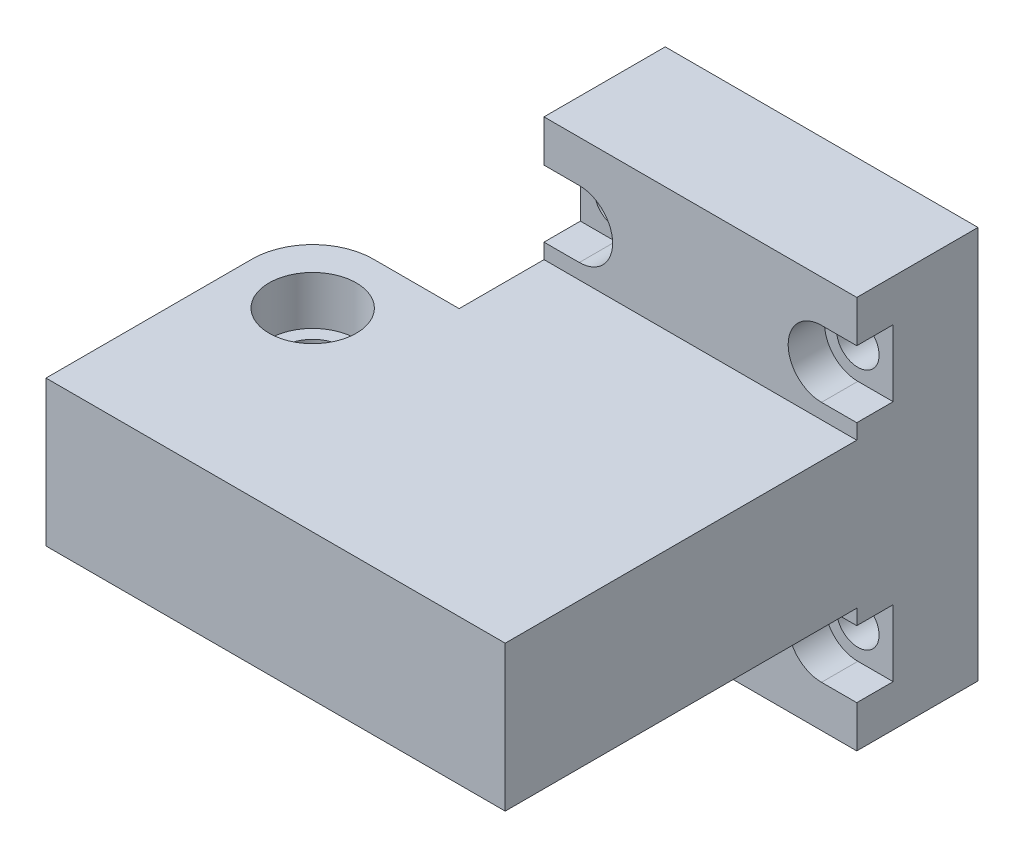
ISO-10303-21;
HEADER;
FILE_DESCRIPTION(('STEP AP214'),'2;1');
FILE_NAME('part.step','',(''),(''),'','','');
FILE_SCHEMA(('AUTOMOTIVE_DESIGN { 1 0 10303 214 1 1 1 1 }'));
ENDSEC;
DATA;
#1=APPLICATION_CONTEXT('core data for automotive mechanical design processes');
#2=APPLICATION_PROTOCOL_DEFINITION('international standard','automotive_design',2000,#1);
#3=PRODUCT_CONTEXT('',#1,'mechanical');
#4=PRODUCT('Part','Part','',(#3));
#5=PRODUCT_RELATED_PRODUCT_CATEGORY('part','',(#4));
#6=PRODUCT_DEFINITION_FORMATION('','',#4);
#7=PRODUCT_DEFINITION_CONTEXT('part definition',#1,'design');
#8=PRODUCT_DEFINITION('design','',#6,#7);
#9=PRODUCT_DEFINITION_SHAPE('','',#8);
#10=(LENGTH_UNIT() NAMED_UNIT(*) SI_UNIT(.MILLI.,.METRE.));
#11=(NAMED_UNIT(*) PLANE_ANGLE_UNIT() SI_UNIT($,.RADIAN.));
#12=(NAMED_UNIT(*) SI_UNIT($,.STERADIAN.) SOLID_ANGLE_UNIT());
#13=UNCERTAINTY_MEASURE_WITH_UNIT(LENGTH_MEASURE(1.E-05),#10,'distance_accuracy_value','');
#14=(GEOMETRIC_REPRESENTATION_CONTEXT(3) GLOBAL_UNCERTAINTY_ASSIGNED_CONTEXT((#13)) GLOBAL_UNIT_ASSIGNED_CONTEXT((#10,
#11,#12)) REPRESENTATION_CONTEXT('',''));
#15=CARTESIAN_POINT('',(0.,0.,0.));
#16=DIRECTION('',(0.,0.,1.));
#17=DIRECTION('',(1.,0.,0.));
#18=AXIS2_PLACEMENT_3D('',#15,#16,#17);
#19=CARTESIAN_POINT('',(12.070747766079,5.77857142857143,7.));
#20=DIRECTION('',(0.,0.,1.));
#21=DIRECTION('',(1.,0.,0.));
#22=AXIS2_PLACEMENT_3D('',#19,#20,#21);
#23=CYLINDRICAL_SURFACE('',#22,2.75);
#24=DIRECTION('',(0.,0.,1.));
#25=VECTOR('',#24,1.);
#26=CARTESIAN_POINT('',(12.070747766079,8.52857142857143,7.));
#27=LINE('',#26,#25);
#28=CARTESIAN_POINT('',(12.070747766079,8.52857142857143,7.));
#29=VERTEX_POINT('',#28);
#30=CARTESIAN_POINT('',(12.070747766079,8.52857142857143,10.));
#31=VERTEX_POINT('',#30);
#32=EDGE_CURVE('E403',#29,#31,#27,.T.);
#33=ORIENTED_EDGE('',*,*,#32,.T.);
#34=CARTESIAN_POINT('',(12.070747766079,5.77857142857143,10.));
#35=DIRECTION('',(0.,0.,1.));
#36=DIRECTION('',(1.,0.,0.));
#37=AXIS2_PLACEMENT_3D('',#34,#35,#36);
#38=CIRCLE('',#37,2.75);
#39=CARTESIAN_POINT('',(12.070747766079,3.02857142857143,10.));
#40=VERTEX_POINT('',#39);
#41=EDGE_CURVE('E232',#31,#40,#38,.T.);
#42=ORIENTED_EDGE('',*,*,#41,.T.);
#43=DIRECTION('',(0.,0.,1.));
#44=VECTOR('',#43,1.);
#45=CARTESIAN_POINT('',(12.070747766079,3.02857142857143,7.));
#46=LINE('',#45,#44);
#47=CARTESIAN_POINT('',(12.070747766079,3.02857142857143,7.));
#48=VERTEX_POINT('',#47);
#49=EDGE_CURVE('E218',#48,#40,#46,.T.);
#50=ORIENTED_EDGE('',*,*,#49,.F.);
#51=CARTESIAN_POINT('',(12.070747766079,5.77857142857143,7.));
#52=DIRECTION('',(0.,0.,1.));
#53=DIRECTION('',(1.,0.,0.));
#54=AXIS2_PLACEMENT_3D('',#51,#52,#53);
#55=CIRCLE('',#54,2.75);
#56=EDGE_CURVE('E230',#29,#48,#55,.T.);
#57=ORIENTED_EDGE('',*,*,#56,.F.);
#58=EDGE_LOOP('',(#33,#42,#50,#57));
#59=FACE_BOUND('',#58,.T.);
#60=ADVANCED_FACE('F35',(#59),#23,.F.);
#61=CARTESIAN_POINT('',(-7.90925223392101,-14.2214285714286,7.));
#62=DIRECTION('',(0.,0.,1.));
#63=DIRECTION('',(1.,0.,0.));
#64=AXIS2_PLACEMENT_3D('',#61,#62,#63);
#65=CYLINDRICAL_SURFACE('',#64,2.75);
#66=DIRECTION('',(0.,0.,1.));
#67=VECTOR('',#66,1.);
#68=CARTESIAN_POINT('',(-7.90925223392101,-16.9714285714286,7.));
#69=LINE('',#68,#67);
#70=CARTESIAN_POINT('',(-7.90925223392101,-16.9714285714286,7.));
#71=VERTEX_POINT('',#70);
#72=CARTESIAN_POINT('',(-7.90925223392101,-16.9714285714286,10.));
#73=VERTEX_POINT('',#72);
#74=EDGE_CURVE('E461',#71,#73,#69,.T.);
#75=ORIENTED_EDGE('',*,*,#74,.T.);
#76=CARTESIAN_POINT('',(-7.90925223392101,-14.2214285714286,10.));
#77=DIRECTION('',(0.,0.,1.));
#78=DIRECTION('',(1.,0.,0.));
#79=AXIS2_PLACEMENT_3D('',#76,#77,#78);
#80=CIRCLE('',#79,2.75);
#81=CARTESIAN_POINT('',(-7.90925223392101,-11.4714285714286,10.));
#82=VERTEX_POINT('',#81);
#83=EDGE_CURVE('E376',#73,#82,#80,.T.);
#84=ORIENTED_EDGE('',*,*,#83,.T.);
#85=DIRECTION('',(0.,0.,1.));
#86=VECTOR('',#85,1.);
#87=CARTESIAN_POINT('',(-7.90925223392101,-11.4714285714286,7.));
#88=LINE('',#87,#86);
#89=CARTESIAN_POINT('',(-7.90925223392101,-11.4714285714286,7.));
#90=VERTEX_POINT('',#89);
#91=EDGE_CURVE('E490',#90,#82,#88,.T.);
#92=ORIENTED_EDGE('',*,*,#91,.F.);
#93=CARTESIAN_POINT('',(-7.90925223392101,-14.2214285714286,7.));
#94=DIRECTION('',(0.,0.,1.));
#95=DIRECTION('',(1.,0.,0.));
#96=AXIS2_PLACEMENT_3D('',#93,#94,#95);
#97=CIRCLE('',#96,2.75);
#98=EDGE_CURVE('E374',#71,#90,#97,.T.);
#99=ORIENTED_EDGE('',*,*,#98,.F.);
#100=EDGE_LOOP('',(#75,#84,#92,#99));
#101=FACE_BOUND('',#100,.T.);
#102=ADVANCED_FACE('F539',(#101),#65,.F.);
#103=CARTESIAN_POINT('',(-7.90925223392101,5.77857142857143,7.));
#104=DIRECTION('',(0.,0.,1.));
#105=DIRECTION('',(1.,0.,0.));
#106=AXIS2_PLACEMENT_3D('',#103,#104,#105);
#107=CYLINDRICAL_SURFACE('',#106,2.75);
#108=DIRECTION('',(0.,0.,1.));
#109=VECTOR('',#108,1.);
#110=CARTESIAN_POINT('',(-7.90925223392101,3.02857142857143,7.));
#111=LINE('',#110,#109);
#112=CARTESIAN_POINT('',(-7.90925223392101,3.02857142857143,7.));
#113=VERTEX_POINT('',#112);
#114=CARTESIAN_POINT('',(-7.90925223392101,3.02857142857143,10.));
#115=VERTEX_POINT('',#114);
#116=EDGE_CURVE('E470',#113,#115,#111,.T.);
#117=ORIENTED_EDGE('',*,*,#116,.T.);
#118=CARTESIAN_POINT('',(-7.90925223392101,5.77857142857143,10.));
#119=DIRECTION('',(0.,0.,1.));
#120=DIRECTION('',(1.,0.,0.));
#121=AXIS2_PLACEMENT_3D('',#118,#119,#120);
#122=CIRCLE('',#121,2.75);
#123=CARTESIAN_POINT('',(-7.90925223392101,8.52857142857143,10.));
#124=VERTEX_POINT('',#123);
#125=EDGE_CURVE('E371',#115,#124,#122,.T.);
#126=ORIENTED_EDGE('',*,*,#125,.T.);
#127=DIRECTION('',(0.,0.,1.));
#128=VECTOR('',#127,1.);
#129=CARTESIAN_POINT('',(-7.90925223392101,8.52857142857143,7.));
#130=LINE('',#129,#128);
#131=CARTESIAN_POINT('',(-7.90925223392101,8.52857142857143,7.));
#132=VERTEX_POINT('',#131);
#133=EDGE_CURVE('E468',#132,#124,#130,.T.);
#134=ORIENTED_EDGE('',*,*,#133,.F.);
#135=CARTESIAN_POINT('',(-7.90925223392101,5.77857142857143,7.));
#136=DIRECTION('',(0.,0.,1.));
#137=DIRECTION('',(1.,0.,0.));
#138=AXIS2_PLACEMENT_3D('',#135,#136,#137);
#139=CIRCLE('',#138,2.75);
#140=EDGE_CURVE('E240',#113,#132,#139,.T.);
#141=ORIENTED_EDGE('',*,*,#140,.F.);
#142=EDGE_LOOP('',(#117,#126,#134,#141));
#143=FACE_BOUND('',#142,.T.);
#144=ADVANCED_FACE('F466',(#143),#107,.F.);
#145=CARTESIAN_POINT('',(12.070747766079,-14.2214285714286,7.));
#146=DIRECTION('',(0.,0.,1.));
#147=DIRECTION('',(1.,0.,0.));
#148=AXIS2_PLACEMENT_3D('',#145,#146,#147);
#149=CYLINDRICAL_SURFACE('',#148,2.75);
#150=DIRECTION('',(0.,0.,1.));
#151=VECTOR('',#150,1.);
#152=CARTESIAN_POINT('',(12.070747766079,-11.4714285714286,7.));
#153=LINE('',#152,#151);
#154=CARTESIAN_POINT('',(12.070747766079,-11.4714285714286,7.));
#155=VERTEX_POINT('',#154);
#156=CARTESIAN_POINT('',(12.070747766079,-11.4714285714286,10.));
#157=VERTEX_POINT('',#156);
#158=EDGE_CURVE('E391',#155,#157,#153,.T.);
#159=ORIENTED_EDGE('',*,*,#158,.T.);
#160=CARTESIAN_POINT('',(12.070747766079,-14.2214285714286,10.));
#161=DIRECTION('',(0.,0.,1.));
#162=DIRECTION('',(1.,0.,0.));
#163=AXIS2_PLACEMENT_3D('',#160,#161,#162);
#164=CIRCLE('',#163,2.75);
#165=CARTESIAN_POINT('',(12.070747766079,-16.9714285714286,10.));
#166=VERTEX_POINT('',#165);
#167=EDGE_CURVE('E243',#157,#166,#164,.T.);
#168=ORIENTED_EDGE('',*,*,#167,.T.);
#169=DIRECTION('',(0.,0.,1.));
#170=VECTOR('',#169,1.);
#171=CARTESIAN_POINT('',(12.070747766079,-16.9714285714286,7.));
#172=LINE('',#171,#170);
#173=CARTESIAN_POINT('',(12.070747766079,-16.9714285714286,7.));
#174=VERTEX_POINT('',#173);
#175=EDGE_CURVE('E389',#174,#166,#172,.T.);
#176=ORIENTED_EDGE('',*,*,#175,.F.);
#177=CARTESIAN_POINT('',(12.070747766079,-14.2214285714286,7.));
#178=DIRECTION('',(0.,0.,1.));
#179=DIRECTION('',(1.,0.,0.));
#180=AXIS2_PLACEMENT_3D('',#177,#178,#179);
#181=CIRCLE('',#180,2.75);
#182=EDGE_CURVE('E378',#155,#174,#181,.T.);
#183=ORIENTED_EDGE('',*,*,#182,.F.);
#184=EDGE_LOOP('',(#159,#168,#176,#183));
#185=FACE_BOUND('',#184,.T.);
#186=ADVANCED_FACE('F388',(#185),#149,.F.);
#187=CARTESIAN_POINT('',(-16.899252233921,1.77857142857142,23.));
#188=DIRECTION('',(0.,-1.,0.));
#189=DIRECTION('',(1.,0.,0.));
#190=AXIS2_PLACEMENT_3D('',#187,#188,#189);
#191=CYLINDRICAL_SURFACE('',#190,2.5);
#192=CARTESIAN_POINT('',(-16.899252233921,-10.2214285714286,23.));
#193=DIRECTION('',(0.,-1.,0.));
#194=DIRECTION('',(1.,0.,0.));
#195=AXIS2_PLACEMENT_3D('',#192,#193,#194);
#196=CIRCLE('',#195,2.5);
#197=CARTESIAN_POINT('',(-14.399252233921,-10.2214285714286,23.));
#198=VERTEX_POINT('',#197);
#199=EDGE_CURVE('E344',#198,#198,#196,.T.);
#200=ORIENTED_EDGE('',*,*,#199,.T.);
#201=EDGE_LOOP('',(#200));
#202=FACE_BOUND('',#201,.T.);
#203=CARTESIAN_POINT('',(-16.899252233921,-2.22142857142858,23.));
#204=DIRECTION('',(0.,1.,0.));
#205=DIRECTION('',(0.,0.,1.));
#206=AXIS2_PLACEMENT_3D('',#203,#204,#205);
#207=CIRCLE('',#206,2.5);
#208=CARTESIAN_POINT('',(-16.899252233921,-2.22142857142858,25.5));
#209=VERTEX_POINT('',#208);
#210=EDGE_CURVE('E39',#209,#209,#207,.F.);
#211=ORIENTED_EDGE('',*,*,#210,.F.);
#212=EDGE_LOOP('',(#211));
#213=FACE_BOUND('',#212,.T.);
#214=ADVANCED_FACE('F568',(#202,#213),#191,.F.);
#215=CARTESIAN_POINT('',(-10.819252233921,11.9785714285714,10.));
#216=DIRECTION('',(1.,0.,0.));
#217=DIRECTION('',(0.,1.,0.));
#218=AXIS2_PLACEMENT_3D('',#215,#216,#217);
#219=PLANE('',#218);
#220=DIRECTION('',(0.,-1.,0.));
#221=VECTOR('',#220,1.);
#222=CARTESIAN_POINT('',(-10.819252233921,11.9785714285714,10.));
#223=LINE('',#222,#221);
#224=CARTESIAN_POINT('',(-10.819252233921,3.02857142857143,10.));
#225=VERTEX_POINT('',#224);
#226=CARTESIAN_POINT('',(-10.819252233921,1.77857142857142,10.));
#227=VERTEX_POINT('',#226);
#228=EDGE_CURVE('E270',#225,#227,#223,.T.);
#229=ORIENTED_EDGE('',*,*,#228,.F.);
#230=DIRECTION('',(0.,0.,1.));
#231=VECTOR('',#230,1.);
#232=CARTESIAN_POINT('',(-10.819252233921,3.02857142857143,7.));
#233=LINE('',#232,#231);
#234=CARTESIAN_POINT('',(-10.819252233921,3.02857142857143,7.));
#235=VERTEX_POINT('',#234);
#236=EDGE_CURVE('E474',#235,#225,#233,.T.);
#237=ORIENTED_EDGE('',*,*,#236,.F.);
#238=DIRECTION('',(0.,-1.,0.));
#239=VECTOR('',#238,1.);
#240=CARTESIAN_POINT('',(-10.819252233921,3.02857142857143,7.));
#241=LINE('',#240,#239);
#242=CARTESIAN_POINT('',(-10.819252233921,8.52857142857143,7.));
#243=VERTEX_POINT('',#242);
#244=EDGE_CURVE('E883',#243,#235,#241,.T.);
#245=ORIENTED_EDGE('',*,*,#244,.F.);
#246=DIRECTION('',(0.,0.,1.));
#247=VECTOR('',#246,1.);
#248=CARTESIAN_POINT('',(-10.819252233921,8.52857142857143,7.));
#249=LINE('',#248,#247);
#250=CARTESIAN_POINT('',(-10.819252233921,8.52857142857143,10.));
#251=VERTEX_POINT('',#250);
#252=EDGE_CURVE('E454',#243,#251,#249,.T.);
#253=ORIENTED_EDGE('',*,*,#252,.T.);
#254=CARTESIAN_POINT('',(-10.819252233921,11.9785714285714,10.));
#255=VERTEX_POINT('',#254);
#256=EDGE_CURVE('E266',#255,#251,#223,.T.);
#257=ORIENTED_EDGE('',*,*,#256,.F.);
#258=DIRECTION('',(0.,0.,-1.));
#259=VECTOR('',#258,1.);
#260=CARTESIAN_POINT('',(-10.819252233921,11.9785714285714,10.));
#261=LINE('',#260,#259);
#262=CARTESIAN_POINT('',(-10.819252233921,11.9785714285714,0.));
#263=VERTEX_POINT('',#262);
#264=EDGE_CURVE('E281',#255,#263,#261,.T.);
#265=ORIENTED_EDGE('',*,*,#264,.T.);
#266=DIRECTION('',(0.,-1.,0.));
#267=VECTOR('',#266,1.);
#268=CARTESIAN_POINT('',(-10.819252233921,11.9785714285714,0.));
#269=LINE('',#268,#267);
#270=CARTESIAN_POINT('',(-10.819252233921,-20.4214285714286,0.));
#271=VERTEX_POINT('',#270);
#272=EDGE_CURVE('E265',#263,#271,#269,.T.);
#273=ORIENTED_EDGE('',*,*,#272,.T.);
#274=DIRECTION('',(0.,0.,-1.));
#275=VECTOR('',#274,1.);
#276=CARTESIAN_POINT('',(-10.819252233921,-20.4214285714286,10.));
#277=LINE('',#276,#275);
#278=CARTESIAN_POINT('',(-10.819252233921,-20.4214285714286,10.));
#279=VERTEX_POINT('',#278);
#280=EDGE_CURVE('E299',#279,#271,#277,.T.);
#281=ORIENTED_EDGE('',*,*,#280,.F.);
#282=CARTESIAN_POINT('',(-10.819252233921,-16.9714285714286,10.));
#283=VERTEX_POINT('',#282);
#284=EDGE_CURVE('E290',#283,#279,#223,.T.);
#285=ORIENTED_EDGE('',*,*,#284,.F.);
#286=DIRECTION('',(0.,0.,1.));
#287=VECTOR('',#286,1.);
#288=CARTESIAN_POINT('',(-10.819252233921,-16.9714285714286,7.));
#289=LINE('',#288,#287);
#290=CARTESIAN_POINT('',(-10.819252233921,-16.9714285714286,7.));
#291=VERTEX_POINT('',#290);
#292=EDGE_CURVE('E496',#291,#283,#289,.T.);
#293=ORIENTED_EDGE('',*,*,#292,.F.);
#294=DIRECTION('',(0.,-1.,0.));
#295=VECTOR('',#294,1.);
#296=CARTESIAN_POINT('',(-10.819252233921,-11.4714285714286,7.));
#297=LINE('',#296,#295);
#298=CARTESIAN_POINT('',(-10.819252233921,-11.4714285714286,7.));
#299=VERTEX_POINT('',#298);
#300=EDGE_CURVE('E486',#299,#291,#297,.T.);
#301=ORIENTED_EDGE('',*,*,#300,.F.);
#302=DIRECTION('',(0.,0.,1.));
#303=VECTOR('',#302,1.);
#304=CARTESIAN_POINT('',(-10.819252233921,-11.4714285714286,7.));
#305=LINE('',#304,#303);
#306=CARTESIAN_POINT('',(-10.819252233921,-11.4714285714286,10.));
#307=VERTEX_POINT('',#306);
#308=EDGE_CURVE('E498',#299,#307,#305,.T.);
#309=ORIENTED_EDGE('',*,*,#308,.T.);
#310=CARTESIAN_POINT('',(-10.819252233921,-10.2214285714286,10.));
#311=VERTEX_POINT('',#310);
#312=EDGE_CURVE('E271',#311,#307,#223,.T.);
#313=ORIENTED_EDGE('',*,*,#312,.F.);
#314=DIRECTION('',(0.,0.,-1.));
#315=VECTOR('',#314,1.);
#316=CARTESIAN_POINT('',(-10.819252233921,-10.2214285714286,39.));
#317=LINE('',#316,#315);
#318=CARTESIAN_POINT('',(-10.819252233921,-10.2214285714286,17.));
#319=VERTEX_POINT('',#318);
#320=EDGE_CURVE('E263',#319,#311,#317,.T.);
#321=ORIENTED_EDGE('',*,*,#320,.F.);
#322=DIRECTION('',(0.,-1.,0.));
#323=VECTOR('',#322,1.);
#324=CARTESIAN_POINT('',(-10.819252233921,-10.2214285714286,17.));
#325=LINE('',#324,#323);
#326=CARTESIAN_POINT('',(-10.819252233921,1.77857142857142,17.));
#327=VERTEX_POINT('',#326);
#328=EDGE_CURVE('E343',#327,#319,#325,.T.);
#329=ORIENTED_EDGE('',*,*,#328,.F.);
#330=DIRECTION('',(0.,0.,-1.));
#331=VECTOR('',#330,1.);
#332=CARTESIAN_POINT('',(-10.819252233921,1.77857142857142,39.));
#333=LINE('',#332,#331);
#334=EDGE_CURVE('E251',#327,#227,#333,.T.);
#335=ORIENTED_EDGE('',*,*,#334,.T.);
#336=EDGE_LOOP('',(#229,#237,#245,#253,#257,#265,#273,#281,#285,#293,#301,#309,#313,#321,#329,#335));
#337=FACE_BOUND('',#336,.T.);
#338=ADVANCED_FACE('F452',(#337),#219,.F.);
#339=CARTESIAN_POINT('',(0.,0.,10.));
#340=DIRECTION('',(0.,0.,1.));
#341=DIRECTION('',(1.,0.,0.));
#342=AXIS2_PLACEMENT_3D('',#339,#340,#341);
#343=PLANE('',#342);
#344=DIRECTION('',(-1.,0.,0.));
#345=VECTOR('',#344,1.);
#346=CARTESIAN_POINT('',(12.070747766079,8.52857142857143,10.));
#347=LINE('',#346,#345);
#348=CARTESIAN_POINT('',(14.980747766079,8.52857142857143,10.));
#349=VERTEX_POINT('',#348);
#350=EDGE_CURVE('E224',#349,#31,#347,.T.);
#351=ORIENTED_EDGE('',*,*,#350,.F.);
#352=DIRECTION('',(0.,1.,0.));
#353=VECTOR('',#352,1.);
#354=CARTESIAN_POINT('',(14.980747766079,11.9785714285714,10.));
#355=LINE('',#354,#353);
#356=CARTESIAN_POINT('',(14.980747766079,11.9785714285714,10.));
#357=VERTEX_POINT('',#356);
#358=EDGE_CURVE('E273',#349,#357,#355,.T.);
#359=ORIENTED_EDGE('',*,*,#358,.T.);
#360=DIRECTION('',(-1.,0.,0.));
#361=VECTOR('',#360,1.);
#362=CARTESIAN_POINT('',(-10.819252233921,11.9785714285714,10.));
#363=LINE('',#362,#361);
#364=EDGE_CURVE('E277',#357,#255,#363,.T.);
#365=ORIENTED_EDGE('',*,*,#364,.T.);
#366=ORIENTED_EDGE('',*,*,#256,.T.);
#367=DIRECTION('',(-1.,0.,0.));
#368=VECTOR('',#367,1.);
#369=CARTESIAN_POINT('',(-7.90925223392101,8.52857142857143,10.));
#370=LINE('',#369,#368);
#371=EDGE_CURVE('E457',#124,#251,#370,.T.);
#372=ORIENTED_EDGE('',*,*,#371,.F.);
#373=ORIENTED_EDGE('',*,*,#125,.F.);
#374=DIRECTION('',(1.,0.,0.));
#375=VECTOR('',#374,1.);
#376=CARTESIAN_POINT('',(-7.90925223392101,3.02857142857143,10.));
#377=LINE('',#376,#375);
#378=EDGE_CURVE('E460',#225,#115,#377,.T.);
#379=ORIENTED_EDGE('',*,*,#378,.F.);
#380=ORIENTED_EDGE('',*,*,#228,.T.);
#381=DIRECTION('',(-1.,0.,0.));
#382=VECTOR('',#381,1.);
#383=CARTESIAN_POINT('',(-10.819252233921,1.77857142857142,10.));
#384=LINE('',#383,#382);
#385=CARTESIAN_POINT('',(14.980747766079,1.77857142857142,10.));
#386=VERTEX_POINT('',#385);
#387=EDGE_CURVE('E238',#386,#227,#384,.T.);
#388=ORIENTED_EDGE('',*,*,#387,.F.);
#389=CARTESIAN_POINT('',(14.980747766079,3.02857142857143,10.));
#390=VERTEX_POINT('',#389);
#391=EDGE_CURVE('E279',#386,#390,#355,.T.);
#392=ORIENTED_EDGE('',*,*,#391,.T.);
#393=DIRECTION('',(1.,0.,0.));
#394=VECTOR('',#393,1.);
#395=CARTESIAN_POINT('',(12.070747766079,3.02857142857143,10.));
#396=LINE('',#395,#394);
#397=EDGE_CURVE('E473',#40,#390,#396,.T.);
#398=ORIENTED_EDGE('',*,*,#397,.F.);
#399=ORIENTED_EDGE('',*,*,#41,.F.);
#400=EDGE_LOOP('',(#351,#359,#365,#366,#372,#373,#379,#380,#388,#392,#398,#399));
#401=FACE_BOUND('',#400,.T.);
#402=ADVANCED_FACE('F439',(#401),#343,.T.);
#403=CARTESIAN_POINT('',(-10.819252233921,-20.4214285714286,10.));
#404=DIRECTION('',(0.,1.,0.));
#405=DIRECTION('',(0.,0.,1.));
#406=AXIS2_PLACEMENT_3D('',#403,#404,#405);
#407=PLANE('',#406);
#408=DIRECTION('',(1.,0.,0.));
#409=VECTOR('',#408,1.);
#410=CARTESIAN_POINT('',(-10.819252233921,-20.4214285714286,0.));
#411=LINE('',#410,#409);
#412=CARTESIAN_POINT('',(14.980747766079,-20.4214285714286,0.));
#413=VERTEX_POINT('',#412);
#414=EDGE_CURVE('E284',#271,#413,#411,.T.);
#415=ORIENTED_EDGE('',*,*,#414,.T.);
#416=DIRECTION('',(0.,0.,-1.));
#417=VECTOR('',#416,1.);
#418=CARTESIAN_POINT('',(14.980747766079,-20.4214285714286,10.));
#419=LINE('',#418,#417);
#420=CARTESIAN_POINT('',(14.980747766079,-20.4214285714286,10.));
#421=VERTEX_POINT('',#420);
#422=EDGE_CURVE('E296',#421,#413,#419,.T.);
#423=ORIENTED_EDGE('',*,*,#422,.F.);
#424=DIRECTION('',(1.,0.,0.));
#425=VECTOR('',#424,1.);
#426=CARTESIAN_POINT('',(-10.819252233921,-20.4214285714286,10.));
#427=LINE('',#426,#425);
#428=EDGE_CURVE('E269',#279,#421,#427,.T.);
#429=ORIENTED_EDGE('',*,*,#428,.F.);
#430=ORIENTED_EDGE('',*,*,#280,.T.);
#431=EDGE_LOOP('',(#415,#423,#429,#430));
#432=FACE_BOUND('',#431,.T.);
#433=ADVANCED_FACE('F522',(#432),#407,.F.);
#434=CARTESIAN_POINT('',(14.980747766079,11.9785714285714,10.));
#435=DIRECTION('',(-1.,0.,0.));
#436=DIRECTION('',(0.,-1.,0.));
#437=AXIS2_PLACEMENT_3D('',#434,#435,#436);
#438=PLANE('',#437);
#439=ORIENTED_EDGE('',*,*,#358,.F.);
#440=DIRECTION('',(0.,0.,1.));
#441=VECTOR('',#440,1.);
#442=CARTESIAN_POINT('',(14.980747766079,8.52857142857143,7.));
#443=LINE('',#442,#441);
#444=CARTESIAN_POINT('',(14.980747766079,8.52857142857143,7.));
#445=VERTEX_POINT('',#444);
#446=EDGE_CURVE('E407',#445,#349,#443,.T.);
#447=ORIENTED_EDGE('',*,*,#446,.F.);
#448=DIRECTION('',(0.,1.,0.));
#449=VECTOR('',#448,1.);
#450=CARTESIAN_POINT('',(14.980747766079,3.02857142857143,7.));
#451=LINE('',#450,#449);
#452=CARTESIAN_POINT('',(14.980747766079,3.02857142857143,7.));
#453=VERTEX_POINT('',#452);
#454=EDGE_CURVE('E223',#453,#445,#451,.T.);
#455=ORIENTED_EDGE('',*,*,#454,.F.);
#456=DIRECTION('',(0.,0.,1.));
#457=VECTOR('',#456,1.);
#458=CARTESIAN_POINT('',(14.980747766079,3.02857142857143,7.));
#459=LINE('',#458,#457);
#460=EDGE_CURVE('E221',#453,#390,#459,.T.);
#461=ORIENTED_EDGE('',*,*,#460,.T.);
#462=ORIENTED_EDGE('',*,*,#391,.F.);
#463=DIRECTION('',(0.,0.,-1.));
#464=VECTOR('',#463,1.);
#465=CARTESIAN_POINT('',(14.980747766079,1.77857142857142,39.));
#466=LINE('',#465,#464);
#467=CARTESIAN_POINT('',(14.980747766079,1.77857142857142,39.));
#468=VERTEX_POINT('',#467);
#469=EDGE_CURVE('E257',#468,#386,#466,.T.);
#470=ORIENTED_EDGE('',*,*,#469,.F.);
#471=DIRECTION('',(0.,1.,0.));
#472=VECTOR('',#471,1.);
#473=CARTESIAN_POINT('',(14.980747766079,1.77857142857142,39.));
#474=LINE('',#473,#472);
#475=CARTESIAN_POINT('',(14.980747766079,-10.2214285714286,39.));
#476=VERTEX_POINT('',#475);
#477=EDGE_CURVE('E248',#476,#468,#474,.T.);
#478=ORIENTED_EDGE('',*,*,#477,.F.);
#479=DIRECTION('',(0.,0.,-1.));
#480=VECTOR('',#479,1.);
#481=CARTESIAN_POINT('',(14.980747766079,-10.2214285714286,39.));
#482=LINE('',#481,#480);
#483=CARTESIAN_POINT('',(14.980747766079,-10.2214285714286,10.));
#484=VERTEX_POINT('',#483);
#485=EDGE_CURVE('E260',#476,#484,#482,.T.);
#486=ORIENTED_EDGE('',*,*,#485,.T.);
#487=CARTESIAN_POINT('',(14.980747766079,-11.4714285714286,10.));
#488=VERTEX_POINT('',#487);
#489=EDGE_CURVE('E278',#488,#484,#355,.T.);
#490=ORIENTED_EDGE('',*,*,#489,.F.);
#491=DIRECTION('',(0.,0.,1.));
#492=VECTOR('',#491,1.);
#493=CARTESIAN_POINT('',(14.980747766079,-11.4714285714286,7.));
#494=LINE('',#493,#492);
#495=CARTESIAN_POINT('',(14.980747766079,-11.4714285714286,7.));
#496=VERTEX_POINT('',#495);
#497=EDGE_CURVE('E415',#496,#488,#494,.T.);
#498=ORIENTED_EDGE('',*,*,#497,.F.);
#499=DIRECTION('',(0.,1.,0.));
#500=VECTOR('',#499,1.);
#501=CARTESIAN_POINT('',(14.980747766079,-11.4714285714286,7.));
#502=LINE('',#501,#500);
#503=CARTESIAN_POINT('',(14.980747766079,-16.9714285714286,7.));
#504=VERTEX_POINT('',#503);
#505=EDGE_CURVE('E502',#504,#496,#502,.T.);
#506=ORIENTED_EDGE('',*,*,#505,.F.);
#507=DIRECTION('',(0.,0.,1.));
#508=VECTOR('',#507,1.);
#509=CARTESIAN_POINT('',(14.980747766079,-16.9714285714286,7.));
#510=LINE('',#509,#508);
#511=CARTESIAN_POINT('',(14.980747766079,-16.9714285714286,10.));
#512=VERTEX_POINT('',#511);
#513=EDGE_CURVE('E417',#504,#512,#510,.T.);
#514=ORIENTED_EDGE('',*,*,#513,.T.);
#515=EDGE_CURVE('E274',#421,#512,#355,.T.);
#516=ORIENTED_EDGE('',*,*,#515,.F.);
#517=ORIENTED_EDGE('',*,*,#422,.T.);
#518=DIRECTION('',(0.,1.,0.));
#519=VECTOR('',#518,1.);
#520=CARTESIAN_POINT('',(14.980747766079,11.9785714285714,0.));
#521=LINE('',#520,#519);
#522=CARTESIAN_POINT('',(14.980747766079,11.9785714285714,0.));
#523=VERTEX_POINT('',#522);
#524=EDGE_CURVE('E286',#413,#523,#521,.T.);
#525=ORIENTED_EDGE('',*,*,#524,.T.);
#526=DIRECTION('',(0.,0.,-1.));
#527=VECTOR('',#526,1.);
#528=CARTESIAN_POINT('',(14.980747766079,11.9785714285714,10.));
#529=LINE('',#528,#527);
#530=EDGE_CURVE('E293',#357,#523,#529,.T.);
#531=ORIENTED_EDGE('',*,*,#530,.F.);
#532=EDGE_LOOP('',(#439,#447,#455,#461,#462,#470,#478,#486,#490,#498,#506,#514,#516,#517,#525,#531));
#533=FACE_BOUND('',#532,.T.);
#534=ADVANCED_FACE('F434',(#533),#438,.F.);
#535=CARTESIAN_POINT('',(-10.819252233921,11.9785714285714,10.));
#536=DIRECTION('',(0.,-1.,0.));
#537=DIRECTION('',(0.,0.,-1.));
#538=AXIS2_PLACEMENT_3D('',#535,#536,#537);
#539=PLANE('',#538);
#540=DIRECTION('',(-1.,0.,0.));
#541=VECTOR('',#540,1.);
#542=CARTESIAN_POINT('',(-10.819252233921,11.9785714285714,0.));
#543=LINE('',#542,#541);
#544=EDGE_CURVE('E288',#523,#263,#543,.T.);
#545=ORIENTED_EDGE('',*,*,#544,.T.);
#546=ORIENTED_EDGE('',*,*,#264,.F.);
#547=ORIENTED_EDGE('',*,*,#364,.F.);
#548=ORIENTED_EDGE('',*,*,#530,.T.);
#549=EDGE_LOOP('',(#545,#546,#547,#548));
#550=FACE_BOUND('',#549,.T.);
#551=ADVANCED_FACE('F446',(#550),#539,.F.);
#552=DIRECTION('',(1.,0.,0.));
#553=VECTOR('',#552,1.);
#554=CARTESIAN_POINT('',(-7.90925223392101,-16.9714285714286,10.));
#555=LINE('',#554,#553);
#556=EDGE_CURVE('E487',#283,#73,#555,.T.);
#557=ORIENTED_EDGE('',*,*,#556,.F.);
#558=ORIENTED_EDGE('',*,*,#284,.T.);
#559=ORIENTED_EDGE('',*,*,#428,.T.);
#560=ORIENTED_EDGE('',*,*,#515,.T.);
#561=DIRECTION('',(1.,0.,0.));
#562=VECTOR('',#561,1.);
#563=CARTESIAN_POINT('',(14.980747766079,-16.9714285714286,10.));
#564=LINE('',#563,#562);
#565=EDGE_CURVE('E399',#166,#512,#564,.T.);
#566=ORIENTED_EDGE('',*,*,#565,.F.);
#567=ORIENTED_EDGE('',*,*,#167,.F.);
#568=DIRECTION('',(-1.,0.,0.));
#569=VECTOR('',#568,1.);
#570=CARTESIAN_POINT('',(12.070747766079,-11.4714285714286,10.));
#571=LINE('',#570,#569);
#572=EDGE_CURVE('E397',#488,#157,#571,.T.);
#573=ORIENTED_EDGE('',*,*,#572,.F.);
#574=ORIENTED_EDGE('',*,*,#489,.T.);
#575=DIRECTION('',(1.,0.,0.));
#576=VECTOR('',#575,1.);
#577=CARTESIAN_POINT('',(-10.819252233921,-10.2214285714286,10.));
#578=LINE('',#577,#576);
#579=EDGE_CURVE('E235',#311,#484,#578,.T.);
#580=ORIENTED_EDGE('',*,*,#579,.F.);
#581=ORIENTED_EDGE('',*,*,#312,.T.);
#582=DIRECTION('',(-1.,0.,0.));
#583=VECTOR('',#582,1.);
#584=CARTESIAN_POINT('',(-7.90925223392101,-11.4714285714286,10.));
#585=LINE('',#584,#583);
#586=EDGE_CURVE('E491',#82,#307,#585,.T.);
#587=ORIENTED_EDGE('',*,*,#586,.F.);
#588=ORIENTED_EDGE('',*,*,#83,.F.);
#589=EDGE_LOOP('',(#557,#558,#559,#560,#566,#567,#573,#574,#580,#581,#587,#588));
#590=FACE_BOUND('',#589,.T.);
#591=ADVANCED_FACE('F396',(#590),#343,.T.);
#592=CARTESIAN_POINT('',(0.,0.,0.));
#593=DIRECTION('',(0.,0.,1.));
#594=DIRECTION('',(1.,0.,0.));
#595=AXIS2_PLACEMENT_3D('',#592,#593,#594);
#596=PLANE('',#595);
#597=CARTESIAN_POINT('',(-7.90925223392101,5.77857142857143,0.));
#598=DIRECTION('',(0.,0.,1.));
#599=DIRECTION('',(1.,0.,0.));
#600=AXIS2_PLACEMENT_3D('',#597,#598,#599);
#601=CIRCLE('',#600,1.75);
#602=CARTESIAN_POINT('',(-6.15925223392101,5.77857142857143,0.));
#603=VERTEX_POINT('',#602);
#604=EDGE_CURVE('E346',#603,#603,#601,.T.);
#605=ORIENTED_EDGE('',*,*,#604,.T.);
#606=EDGE_LOOP('',(#605));
#607=FACE_BOUND('',#606,.T.);
#608=CARTESIAN_POINT('',(12.070747766079,-14.2214285714286,0.));
#609=DIRECTION('',(0.,0.,1.));
#610=DIRECTION('',(1.,0.,0.));
#611=AXIS2_PLACEMENT_3D('',#608,#609,#610);
#612=CIRCLE('',#611,1.75);
#613=CARTESIAN_POINT('',(13.820747766079,-14.2214285714286,0.));
#614=VERTEX_POINT('',#613);
#615=EDGE_CURVE('E353',#614,#614,#612,.T.);
#616=ORIENTED_EDGE('',*,*,#615,.T.);
#617=EDGE_LOOP('',(#616));
#618=FACE_BOUND('',#617,.T.);
#619=CARTESIAN_POINT('',(-7.90925223392101,-14.2214285714286,0.));
#620=DIRECTION('',(0.,0.,1.));
#621=DIRECTION('',(1.,0.,0.));
#622=AXIS2_PLACEMENT_3D('',#619,#620,#621);
#623=CIRCLE('',#622,1.75);
#624=CARTESIAN_POINT('',(-6.15925223392101,-14.2214285714286,0.));
#625=VERTEX_POINT('',#624);
#626=EDGE_CURVE('E359',#625,#625,#623,.T.);
#627=ORIENTED_EDGE('',*,*,#626,.T.);
#628=EDGE_LOOP('',(#627));
#629=FACE_BOUND('',#628,.T.);
#630=CARTESIAN_POINT('',(12.070747766079,5.77857142857143,0.));
#631=DIRECTION('',(0.,0.,1.));
#632=DIRECTION('',(1.,0.,0.));
#633=AXIS2_PLACEMENT_3D('',#630,#631,#632);
#634=CIRCLE('',#633,1.75);
#635=CARTESIAN_POINT('',(13.820747766079,5.77857142857143,0.));
#636=VERTEX_POINT('',#635);
#637=EDGE_CURVE('E364',#636,#636,#634,.T.);
#638=ORIENTED_EDGE('',*,*,#637,.T.);
#639=EDGE_LOOP('',(#638));
#640=FACE_BOUND('',#639,.T.);
#641=ORIENTED_EDGE('',*,*,#272,.F.);
#642=ORIENTED_EDGE('',*,*,#544,.F.);
#643=ORIENTED_EDGE('',*,*,#524,.F.);
#644=ORIENTED_EDGE('',*,*,#414,.F.);
#645=EDGE_LOOP('',(#641,#642,#643,#644));
#646=FACE_BOUND('',#645,.T.);
#647=ADVANCED_FACE('F524',(#607,#618,#629,#640,#646),#596,.F.);
#648=CARTESIAN_POINT('',(-10.819252233921,-10.2214285714286,39.));
#649=DIRECTION('',(0.,1.,0.));
#650=DIRECTION('',(-1.,0.,0.));
#651=AXIS2_PLACEMENT_3D('',#648,#649,#650);
#652=PLANE('',#651);
#653=ORIENTED_EDGE('',*,*,#199,.F.);
#654=EDGE_LOOP('',(#653));
#655=FACE_BOUND('',#654,.T.);
#656=DIRECTION('',(0.,0.,1.));
#657=VECTOR('',#656,1.);
#658=CARTESIAN_POINT('',(-22.899252233921,-10.2214285714286,39.));
#659=LINE('',#658,#657);
#660=CARTESIAN_POINT('',(-22.899252233921,-10.2214285714286,22.));
#661=VERTEX_POINT('',#660);
#662=CARTESIAN_POINT('',(-22.899252233921,-10.2214285714286,39.));
#663=VERTEX_POINT('',#662);
#664=EDGE_CURVE('E330',#661,#663,#659,.T.);
#665=ORIENTED_EDGE('',*,*,#664,.F.);
#666=CARTESIAN_POINT('',(-17.899252233921,-10.2214285714286,22.));
#667=DIRECTION('',(0.,1.,0.));
#668=DIRECTION('',(-1.,0.,0.));
#669=AXIS2_PLACEMENT_3D('',#666,#667,#668);
#670=CIRCLE('',#669,5.);
#671=CARTESIAN_POINT('',(-17.899252233921,-10.2214285714286,17.));
#672=VERTEX_POINT('',#671);
#673=EDGE_CURVE('E305',#661,#672,#670,.F.);
#674=ORIENTED_EDGE('',*,*,#673,.T.);
#675=DIRECTION('',(1.,0.,0.));
#676=VECTOR('',#675,1.);
#677=CARTESIAN_POINT('',(-22.899252233921,-10.2214285714286,17.));
#678=LINE('',#677,#676);
#679=EDGE_CURVE('E315',#672,#319,#678,.T.);
#680=ORIENTED_EDGE('',*,*,#679,.T.);
#681=ORIENTED_EDGE('',*,*,#320,.T.);
#682=ORIENTED_EDGE('',*,*,#579,.T.);
#683=ORIENTED_EDGE('',*,*,#485,.F.);
#684=DIRECTION('',(1.,0.,0.));
#685=VECTOR('',#684,1.);
#686=CARTESIAN_POINT('',(-10.819252233921,-10.2214285714286,39.));
#687=LINE('',#686,#685);
#688=EDGE_CURVE('E246',#663,#476,#687,.T.);
#689=ORIENTED_EDGE('',*,*,#688,.F.);
#690=EDGE_LOOP('',(#665,#674,#680,#681,#682,#683,#689));
#691=FACE_BOUND('',#690,.T.);
#692=ADVANCED_FACE('F334',(#655,#691),#652,.F.);
#693=CARTESIAN_POINT('',(-10.819252233921,1.77857142857142,39.));
#694=DIRECTION('',(0.,-1.,0.));
#695=DIRECTION('',(0.,0.,-1.));
#696=AXIS2_PLACEMENT_3D('',#693,#694,#695);
#697=PLANE('',#696);
#698=CARTESIAN_POINT('',(-16.899252233921,1.77857142857142,23.));
#699=DIRECTION('',(0.,1.,0.));
#700=DIRECTION('',(0.,0.,1.));
#701=AXIS2_PLACEMENT_3D('',#698,#699,#700);
#702=CIRCLE('',#701,3.6);
#703=CARTESIAN_POINT('',(-16.899252233921,1.77857142857142,26.6));
#704=VERTEX_POINT('',#703);
#705=EDGE_CURVE('E414',#704,#704,#702,.T.);
#706=ORIENTED_EDGE('',*,*,#705,.F.);
#707=EDGE_LOOP('',(#706));
#708=FACE_BOUND('',#707,.T.);
#709=DIRECTION('',(1.,0.,0.));
#710=VECTOR('',#709,1.);
#711=CARTESIAN_POINT('',(-22.899252233921,1.77857142857142,17.));
#712=LINE('',#711,#710);
#713=CARTESIAN_POINT('',(-17.899252233921,1.77857142857142,17.));
#714=VERTEX_POINT('',#713);
#715=EDGE_CURVE('E313',#714,#327,#712,.T.);
#716=ORIENTED_EDGE('',*,*,#715,.F.);
#717=CARTESIAN_POINT('',(-17.899252233921,1.77857142857142,22.));
#718=DIRECTION('',(0.,-1.,0.));
#719=DIRECTION('',(0.,0.,-1.));
#720=AXIS2_PLACEMENT_3D('',#717,#718,#719);
#721=CIRCLE('',#720,5.);
#722=CARTESIAN_POINT('',(-22.899252233921,1.77857142857142,22.));
#723=VERTEX_POINT('',#722);
#724=EDGE_CURVE('E11',#714,#723,#721,.F.);
#725=ORIENTED_EDGE('',*,*,#724,.T.);
#726=DIRECTION('',(0.,0.,-1.));
#727=VECTOR('',#726,1.);
#728=CARTESIAN_POINT('',(-22.899252233921,1.77857142857142,39.));
#729=LINE('',#728,#727);
#730=CARTESIAN_POINT('',(-22.899252233921,1.77857142857142,39.));
#731=VERTEX_POINT('',#730);
#732=EDGE_CURVE('E332',#731,#723,#729,.T.);
#733=ORIENTED_EDGE('',*,*,#732,.F.);
#734=DIRECTION('',(-1.,0.,0.));
#735=VECTOR('',#734,1.);
#736=CARTESIAN_POINT('',(-10.819252233921,1.77857142857142,39.));
#737=LINE('',#736,#735);
#738=EDGE_CURVE('E250',#468,#731,#737,.T.);
#739=ORIENTED_EDGE('',*,*,#738,.F.);
#740=ORIENTED_EDGE('',*,*,#469,.T.);
#741=ORIENTED_EDGE('',*,*,#387,.T.);
#742=ORIENTED_EDGE('',*,*,#334,.F.);
#743=EDGE_LOOP('',(#716,#725,#733,#739,#740,#741,#742));
#744=FACE_BOUND('',#743,.T.);
#745=ADVANCED_FACE('F320',(#708,#744),#697,.F.);
#746=CARTESIAN_POINT('',(0.,0.,39.));
#747=DIRECTION('',(0.,0.,1.));
#748=DIRECTION('',(1.,0.,0.));
#749=AXIS2_PLACEMENT_3D('',#746,#747,#748);
#750=PLANE('',#749);
#751=ORIENTED_EDGE('',*,*,#738,.T.);
#752=DIRECTION('',(0.,1.,0.));
#753=VECTOR('',#752,1.);
#754=CARTESIAN_POINT('',(-22.899252233921,-10.2214285714286,39.));
#755=LINE('',#754,#753);
#756=EDGE_CURVE('E339',#663,#731,#755,.T.);
#757=ORIENTED_EDGE('',*,*,#756,.F.);
#758=ORIENTED_EDGE('',*,*,#688,.T.);
#759=ORIENTED_EDGE('',*,*,#477,.T.);
#760=EDGE_LOOP('',(#751,#757,#758,#759));
#761=FACE_BOUND('',#760,.T.);
#762=ADVANCED_FACE('F427',(#761),#750,.T.);
#763=CARTESIAN_POINT('',(12.070747766079,5.77857142857143,7.));
#764=DIRECTION('',(0.,0.,1.));
#765=DIRECTION('',(1.,0.,0.));
#766=AXIS2_PLACEMENT_3D('',#763,#764,#765);
#767=PLANE('',#766);
#768=CARTESIAN_POINT('',(12.070747766079,5.77857142857143,7.));
#769=DIRECTION('',(0.,0.,1.));
#770=DIRECTION('',(1.,0.,0.));
#771=AXIS2_PLACEMENT_3D('',#768,#769,#770);
#772=CIRCLE('',#771,1.75);
#773=CARTESIAN_POINT('',(13.820747766079,5.77857142857143,7.));
#774=VERTEX_POINT('',#773);
#775=EDGE_CURVE('E349',#774,#774,#772,.T.);
#776=ORIENTED_EDGE('',*,*,#775,.F.);
#777=EDGE_LOOP('',(#776));
#778=FACE_BOUND('',#777,.T.);
#779=ORIENTED_EDGE('',*,*,#56,.T.);
#780=DIRECTION('',(1.,0.,0.));
#781=VECTOR('',#780,1.);
#782=CARTESIAN_POINT('',(12.070747766079,3.02857142857143,7.));
#783=LINE('',#782,#781);
#784=EDGE_CURVE('E215',#48,#453,#783,.T.);
#785=ORIENTED_EDGE('',*,*,#784,.T.);
#786=ORIENTED_EDGE('',*,*,#454,.T.);
#787=DIRECTION('',(-1.,0.,0.));
#788=VECTOR('',#787,1.);
#789=CARTESIAN_POINT('',(12.070747766079,8.52857142857143,7.));
#790=LINE('',#789,#788);
#791=EDGE_CURVE('E51',#445,#29,#790,.T.);
#792=ORIENTED_EDGE('',*,*,#791,.T.);
#793=EDGE_LOOP('',(#779,#785,#786,#792));
#794=FACE_BOUND('',#793,.T.);
#795=ADVANCED_FACE('F234',(#778,#794),#767,.T.);
#796=CARTESIAN_POINT('',(12.070747766079,-14.2214285714286,7.));
#797=DIRECTION('',(0.,0.,1.));
#798=DIRECTION('',(1.,0.,0.));
#799=AXIS2_PLACEMENT_3D('',#796,#797,#798);
#800=PLANE('',#799);
#801=CARTESIAN_POINT('',(12.070747766079,-14.2214285714286,7.));
#802=DIRECTION('',(0.,0.,1.));
#803=DIRECTION('',(1.,0.,0.));
#804=AXIS2_PLACEMENT_3D('',#801,#802,#803);
#805=CIRCLE('',#804,1.75);
#806=CARTESIAN_POINT('',(13.820747766079,-14.2214285714286,7.));
#807=VERTEX_POINT('',#806);
#808=EDGE_CURVE('E356',#807,#807,#805,.T.);
#809=ORIENTED_EDGE('',*,*,#808,.F.);
#810=EDGE_LOOP('',(#809));
#811=FACE_BOUND('',#810,.T.);
#812=ORIENTED_EDGE('',*,*,#182,.T.);
#813=DIRECTION('',(1.,0.,0.));
#814=VECTOR('',#813,1.);
#815=CARTESIAN_POINT('',(14.980747766079,-16.9714285714286,7.));
#816=LINE('',#815,#814);
#817=EDGE_CURVE('E405',#174,#504,#816,.T.);
#818=ORIENTED_EDGE('',*,*,#817,.T.);
#819=ORIENTED_EDGE('',*,*,#505,.T.);
#820=DIRECTION('',(-1.,0.,0.));
#821=VECTOR('',#820,1.);
#822=CARTESIAN_POINT('',(12.070747766079,-11.4714285714286,7.));
#823=LINE('',#822,#821);
#824=EDGE_CURVE('E410',#496,#155,#823,.T.);
#825=ORIENTED_EDGE('',*,*,#824,.T.);
#826=EDGE_LOOP('',(#812,#818,#819,#825));
#827=FACE_BOUND('',#826,.T.);
#828=ADVANCED_FACE('F505',(#811,#827),#800,.T.);
#829=CARTESIAN_POINT('',(-7.90925223392101,-14.2214285714286,7.));
#830=DIRECTION('',(0.,0.,1.));
#831=DIRECTION('',(1.,0.,0.));
#832=AXIS2_PLACEMENT_3D('',#829,#830,#831);
#833=PLANE('',#832);
#834=CARTESIAN_POINT('',(-7.90925223392101,-14.2214285714286,7.));
#835=DIRECTION('',(0.,0.,1.));
#836=DIRECTION('',(1.,0.,0.));
#837=AXIS2_PLACEMENT_3D('',#834,#835,#836);
#838=CIRCLE('',#837,1.75);
#839=CARTESIAN_POINT('',(-6.15925223392101,-14.2214285714286,7.));
#840=VERTEX_POINT('',#839);
#841=EDGE_CURVE('E323',#840,#840,#838,.T.);
#842=ORIENTED_EDGE('',*,*,#841,.F.);
#843=EDGE_LOOP('',(#842));
#844=FACE_BOUND('',#843,.T.);
#845=ORIENTED_EDGE('',*,*,#98,.T.);
#846=DIRECTION('',(-1.,0.,0.));
#847=VECTOR('',#846,1.);
#848=CARTESIAN_POINT('',(-7.90925223392101,-11.4714285714286,7.));
#849=LINE('',#848,#847);
#850=EDGE_CURVE('E483',#90,#299,#849,.T.);
#851=ORIENTED_EDGE('',*,*,#850,.T.);
#852=ORIENTED_EDGE('',*,*,#300,.T.);
#853=DIRECTION('',(1.,0.,0.));
#854=VECTOR('',#853,1.);
#855=CARTESIAN_POINT('',(-7.90925223392101,-16.9714285714286,7.));
#856=LINE('',#855,#854);
#857=EDGE_CURVE('E59',#291,#71,#856,.T.);
#858=ORIENTED_EDGE('',*,*,#857,.T.);
#859=EDGE_LOOP('',(#845,#851,#852,#858));
#860=FACE_BOUND('',#859,.T.);
#861=ADVANCED_FACE('F604',(#844,#860),#833,.T.);
#862=CARTESIAN_POINT('',(-7.90925223392101,5.77857142857143,7.));
#863=DIRECTION('',(0.,0.,1.));
#864=DIRECTION('',(1.,0.,0.));
#865=AXIS2_PLACEMENT_3D('',#862,#863,#864);
#866=PLANE('',#865);
#867=CARTESIAN_POINT('',(-7.90925223392101,5.77857142857143,7.));
#868=DIRECTION('',(0.,0.,1.));
#869=DIRECTION('',(1.,0.,0.));
#870=AXIS2_PLACEMENT_3D('',#867,#868,#869);
#871=CIRCLE('',#870,1.75);
#872=CARTESIAN_POINT('',(-6.15925223392101,5.77857142857143,7.));
#873=VERTEX_POINT('',#872);
#874=EDGE_CURVE('E350',#873,#873,#871,.T.);
#875=ORIENTED_EDGE('',*,*,#874,.F.);
#876=EDGE_LOOP('',(#875));
#877=FACE_BOUND('',#876,.T.);
#878=ORIENTED_EDGE('',*,*,#140,.T.);
#879=DIRECTION('',(-1.,0.,0.));
#880=VECTOR('',#879,1.);
#881=CARTESIAN_POINT('',(-7.90925223392101,8.52857142857143,7.));
#882=LINE('',#881,#880);
#883=EDGE_CURVE('E880',#132,#243,#882,.T.);
#884=ORIENTED_EDGE('',*,*,#883,.T.);
#885=ORIENTED_EDGE('',*,*,#244,.T.);
#886=DIRECTION('',(1.,0.,0.));
#887=VECTOR('',#886,1.);
#888=CARTESIAN_POINT('',(-7.90925223392101,3.02857142857143,7.));
#889=LINE('',#888,#887);
#890=EDGE_CURVE('E482',#235,#113,#889,.T.);
#891=ORIENTED_EDGE('',*,*,#890,.T.);
#892=EDGE_LOOP('',(#878,#884,#885,#891));
#893=FACE_BOUND('',#892,.T.);
#894=ADVANCED_FACE('F600',(#877,#893),#866,.T.);
#895=CARTESIAN_POINT('',(12.070747766079,5.77857142857143,0.));
#896=DIRECTION('',(0.,0.,1.));
#897=DIRECTION('',(1.,0.,0.));
#898=AXIS2_PLACEMENT_3D('',#895,#896,#897);
#899=CYLINDRICAL_SURFACE('',#898,1.75);
#900=ORIENTED_EDGE('',*,*,#637,.F.);
#901=EDGE_LOOP('',(#900));
#902=FACE_BOUND('',#901,.T.);
#903=ORIENTED_EDGE('',*,*,#775,.T.);
#904=EDGE_LOOP('',(#903));
#905=FACE_BOUND('',#904,.T.);
#906=ADVANCED_FACE('F590',(#902,#905),#899,.F.);
#907=CARTESIAN_POINT('',(-7.90925223392101,5.77857142857143,0.));
#908=DIRECTION('',(0.,0.,1.));
#909=DIRECTION('',(1.,0.,0.));
#910=AXIS2_PLACEMENT_3D('',#907,#908,#909);
#911=CYLINDRICAL_SURFACE('',#910,1.75);
#912=ORIENTED_EDGE('',*,*,#604,.F.);
#913=EDGE_LOOP('',(#912));
#914=FACE_BOUND('',#913,.T.);
#915=ORIENTED_EDGE('',*,*,#874,.T.);
#916=EDGE_LOOP('',(#915));
#917=FACE_BOUND('',#916,.T.);
#918=ADVANCED_FACE('F586',(#914,#917),#911,.F.);
#919=CARTESIAN_POINT('',(-7.90925223392101,-14.2214285714286,0.));
#920=DIRECTION('',(0.,0.,1.));
#921=DIRECTION('',(1.,0.,0.));
#922=AXIS2_PLACEMENT_3D('',#919,#920,#921);
#923=CYLINDRICAL_SURFACE('',#922,1.75);
#924=ORIENTED_EDGE('',*,*,#626,.F.);
#925=EDGE_LOOP('',(#924));
#926=FACE_BOUND('',#925,.T.);
#927=ORIENTED_EDGE('',*,*,#841,.T.);
#928=EDGE_LOOP('',(#927));
#929=FACE_BOUND('',#928,.T.);
#930=ADVANCED_FACE('F589',(#926,#929),#923,.F.);
#931=CARTESIAN_POINT('',(12.070747766079,-14.2214285714286,0.));
#932=DIRECTION('',(0.,0.,1.));
#933=DIRECTION('',(1.,0.,0.));
#934=AXIS2_PLACEMENT_3D('',#931,#932,#933);
#935=CYLINDRICAL_SURFACE('',#934,1.75);
#936=ORIENTED_EDGE('',*,*,#615,.F.);
#937=EDGE_LOOP('',(#936));
#938=FACE_BOUND('',#937,.T.);
#939=ORIENTED_EDGE('',*,*,#808,.T.);
#940=EDGE_LOOP('',(#939));
#941=FACE_BOUND('',#940,.T.);
#942=ADVANCED_FACE('F585',(#938,#941),#935,.F.);
#943=CARTESIAN_POINT('',(-22.899252233921,-10.2214285714286,17.));
#944=DIRECTION('',(0.,0.,1.));
#945=DIRECTION('',(1.,0.,0.));
#946=AXIS2_PLACEMENT_3D('',#943,#944,#945);
#947=PLANE('',#946);
#948=ORIENTED_EDGE('',*,*,#679,.F.);
#949=DIRECTION('',(0.,-1.,0.));
#950=VECTOR('',#949,1.);
#951=CARTESIAN_POINT('',(-17.899252233921,1.77857142857142,17.));
#952=LINE('',#951,#950);
#953=EDGE_CURVE('E44',#672,#714,#952,.F.);
#954=ORIENTED_EDGE('',*,*,#953,.T.);
#955=ORIENTED_EDGE('',*,*,#715,.T.);
#956=ORIENTED_EDGE('',*,*,#328,.T.);
#957=EDGE_LOOP('',(#948,#954,#955,#956));
#958=FACE_BOUND('',#957,.T.);
#959=ADVANCED_FACE('F311',(#958),#947,.F.);
#960=CARTESIAN_POINT('',(-22.899252233921,0.,0.));
#961=DIRECTION('',(-1.,0.,0.));
#962=DIRECTION('',(0.,-1.,0.));
#963=AXIS2_PLACEMENT_3D('',#960,#961,#962);
#964=PLANE('',#963);
#965=ORIENTED_EDGE('',*,*,#732,.T.);
#966=DIRECTION('',(0.,-1.,0.));
#967=VECTOR('',#966,1.);
#968=CARTESIAN_POINT('',(-22.899252233921,-10.2214285714286,22.));
#969=LINE('',#968,#967);
#970=EDGE_CURVE('E302',#723,#661,#969,.T.);
#971=ORIENTED_EDGE('',*,*,#970,.T.);
#972=ORIENTED_EDGE('',*,*,#664,.T.);
#973=ORIENTED_EDGE('',*,*,#756,.T.);
#974=EDGE_LOOP('',(#965,#971,#972,#973));
#975=FACE_BOUND('',#974,.T.);
#976=ADVANCED_FACE('F328',(#975),#964,.T.);
#977=CARTESIAN_POINT('',(-17.899252233921,0.,22.));
#978=DIRECTION('',(0.,1.,0.));
#979=DIRECTION('',(-1.,0.,0.));
#980=AXIS2_PLACEMENT_3D('',#977,#978,#979);
#981=CYLINDRICAL_SURFACE('',#980,5.);
#982=ORIENTED_EDGE('',*,*,#724,.F.);
#983=ORIENTED_EDGE('',*,*,#953,.F.);
#984=ORIENTED_EDGE('',*,*,#673,.F.);
#985=ORIENTED_EDGE('',*,*,#970,.F.);
#986=EDGE_LOOP('',(#982,#983,#984,#985));
#987=FACE_BOUND('',#986,.T.);
#988=ADVANCED_FACE('F37',(#987),#981,.T.);
#989=CARTESIAN_POINT('',(-16.899252233921,-2.22142857142858,23.));
#990=DIRECTION('',(0.,1.,0.));
#991=DIRECTION('',(0.,0.,1.));
#992=AXIS2_PLACEMENT_3D('',#989,#990,#991);
#993=PLANE('',#992);
#994=CARTESIAN_POINT('',(-16.899252233921,-2.22142857142858,23.));
#995=DIRECTION('',(0.,1.,0.));
#996=DIRECTION('',(0.,0.,1.));
#997=AXIS2_PLACEMENT_3D('',#994,#995,#996);
#998=CIRCLE('',#997,3.6);
#999=CARTESIAN_POINT('',(-16.899252233921,-2.22142857142858,26.6));
#1000=VERTEX_POINT('',#999);
#1001=EDGE_CURVE('E420',#1000,#1000,#998,.T.);
#1002=ORIENTED_EDGE('',*,*,#1001,.T.);
#1003=EDGE_LOOP('',(#1002));
#1004=FACE_BOUND('',#1003,.T.);
#1005=ORIENTED_EDGE('',*,*,#210,.T.);
#1006=EDGE_LOOP('',(#1005));
#1007=FACE_BOUND('',#1006,.T.);
#1008=ADVANCED_FACE('F697',(#1004,#1007),#993,.T.);
#1009=CARTESIAN_POINT('',(-16.899252233921,-2.22142857142858,23.));
#1010=DIRECTION('',(0.,1.,0.));
#1011=DIRECTION('',(0.,0.,1.));
#1012=AXIS2_PLACEMENT_3D('',#1009,#1010,#1011);
#1013=CYLINDRICAL_SURFACE('',#1012,3.6);
#1014=ORIENTED_EDGE('',*,*,#1001,.F.);
#1015=EDGE_LOOP('',(#1014));
#1016=FACE_BOUND('',#1015,.T.);
#1017=ORIENTED_EDGE('',*,*,#705,.T.);
#1018=EDGE_LOOP('',(#1017));
#1019=FACE_BOUND('',#1018,.T.);
#1020=ADVANCED_FACE('F535',(#1016,#1019),#1013,.F.);
#1021=CARTESIAN_POINT('',(12.070747766079,-11.4714285714286,7.));
#1022=DIRECTION('',(0.,1.,0.));
#1023=DIRECTION('',(0.,0.,1.));
#1024=AXIS2_PLACEMENT_3D('',#1021,#1022,#1023);
#1025=PLANE('',#1024);
#1026=ORIENTED_EDGE('',*,*,#572,.T.);
#1027=ORIENTED_EDGE('',*,*,#158,.F.);
#1028=ORIENTED_EDGE('',*,*,#824,.F.);
#1029=ORIENTED_EDGE('',*,*,#497,.T.);
#1030=EDGE_LOOP('',(#1026,#1027,#1028,#1029));
#1031=FACE_BOUND('',#1030,.T.);
#1032=ADVANCED_FACE('F508',(#1031),#1025,.F.);
#1033=CARTESIAN_POINT('',(14.980747766079,-16.9714285714286,7.));
#1034=DIRECTION('',(0.,-1.,0.));
#1035=DIRECTION('',(0.,0.,-1.));
#1036=AXIS2_PLACEMENT_3D('',#1033,#1034,#1035);
#1037=PLANE('',#1036);
#1038=ORIENTED_EDGE('',*,*,#565,.T.);
#1039=ORIENTED_EDGE('',*,*,#513,.F.);
#1040=ORIENTED_EDGE('',*,*,#817,.F.);
#1041=ORIENTED_EDGE('',*,*,#175,.T.);
#1042=EDGE_LOOP('',(#1038,#1039,#1040,#1041));
#1043=FACE_BOUND('',#1042,.T.);
#1044=ADVANCED_FACE('F525',(#1043),#1037,.F.);
#1045=CARTESIAN_POINT('',(-7.90925223392101,3.02857142857143,7.));
#1046=DIRECTION('',(0.,-1.,0.));
#1047=DIRECTION('',(0.,0.,-1.));
#1048=AXIS2_PLACEMENT_3D('',#1045,#1046,#1047);
#1049=PLANE('',#1048);
#1050=ORIENTED_EDGE('',*,*,#378,.T.);
#1051=ORIENTED_EDGE('',*,*,#116,.F.);
#1052=ORIENTED_EDGE('',*,*,#890,.F.);
#1053=ORIENTED_EDGE('',*,*,#236,.T.);
#1054=EDGE_LOOP('',(#1050,#1051,#1052,#1053));
#1055=FACE_BOUND('',#1054,.T.);
#1056=ADVANCED_FACE('F527',(#1055),#1049,.F.);
#1057=CARTESIAN_POINT('',(-7.90925223392101,8.52857142857143,7.));
#1058=DIRECTION('',(0.,1.,0.));
#1059=DIRECTION('',(0.,0.,1.));
#1060=AXIS2_PLACEMENT_3D('',#1057,#1058,#1059);
#1061=PLANE('',#1060);
#1062=ORIENTED_EDGE('',*,*,#371,.T.);
#1063=ORIENTED_EDGE('',*,*,#252,.F.);
#1064=ORIENTED_EDGE('',*,*,#883,.F.);
#1065=ORIENTED_EDGE('',*,*,#133,.T.);
#1066=EDGE_LOOP('',(#1062,#1063,#1064,#1065));
#1067=FACE_BOUND('',#1066,.T.);
#1068=ADVANCED_FACE('F533',(#1067),#1061,.F.);
#1069=CARTESIAN_POINT('',(-7.90925223392101,-16.9714285714286,7.));
#1070=DIRECTION('',(0.,-1.,0.));
#1071=DIRECTION('',(0.,0.,-1.));
#1072=AXIS2_PLACEMENT_3D('',#1069,#1070,#1071);
#1073=PLANE('',#1072);
#1074=ORIENTED_EDGE('',*,*,#556,.T.);
#1075=ORIENTED_EDGE('',*,*,#74,.F.);
#1076=ORIENTED_EDGE('',*,*,#857,.F.);
#1077=ORIENTED_EDGE('',*,*,#292,.T.);
#1078=EDGE_LOOP('',(#1074,#1075,#1076,#1077));
#1079=FACE_BOUND('',#1078,.T.);
#1080=ADVANCED_FACE('F834',(#1079),#1073,.F.);
#1081=CARTESIAN_POINT('',(-7.90925223392101,-11.4714285714286,7.));
#1082=DIRECTION('',(0.,1.,0.));
#1083=DIRECTION('',(0.,0.,1.));
#1084=AXIS2_PLACEMENT_3D('',#1081,#1082,#1083);
#1085=PLANE('',#1084);
#1086=ORIENTED_EDGE('',*,*,#586,.T.);
#1087=ORIENTED_EDGE('',*,*,#308,.F.);
#1088=ORIENTED_EDGE('',*,*,#850,.F.);
#1089=ORIENTED_EDGE('',*,*,#91,.T.);
#1090=EDGE_LOOP('',(#1086,#1087,#1088,#1089));
#1091=FACE_BOUND('',#1090,.T.);
#1092=ADVANCED_FACE('F842',(#1091),#1085,.F.);
#1093=CARTESIAN_POINT('',(12.070747766079,8.52857142857143,7.));
#1094=DIRECTION('',(0.,1.,0.));
#1095=DIRECTION('',(0.,0.,1.));
#1096=AXIS2_PLACEMENT_3D('',#1093,#1094,#1095);
#1097=PLANE('',#1096);
#1098=ORIENTED_EDGE('',*,*,#350,.T.);
#1099=ORIENTED_EDGE('',*,*,#32,.F.);
#1100=ORIENTED_EDGE('',*,*,#791,.F.);
#1101=ORIENTED_EDGE('',*,*,#446,.T.);
#1102=EDGE_LOOP('',(#1098,#1099,#1100,#1101));
#1103=FACE_BOUND('',#1102,.T.);
#1104=ADVANCED_FACE('F851',(#1103),#1097,.F.);
#1105=CARTESIAN_POINT('',(12.070747766079,3.02857142857143,7.));
#1106=DIRECTION('',(0.,-1.,0.));
#1107=DIRECTION('',(0.,0.,-1.));
#1108=AXIS2_PLACEMENT_3D('',#1105,#1106,#1107);
#1109=PLANE('',#1108);
#1110=ORIENTED_EDGE('',*,*,#397,.T.);
#1111=ORIENTED_EDGE('',*,*,#460,.F.);
#1112=ORIENTED_EDGE('',*,*,#784,.F.);
#1113=ORIENTED_EDGE('',*,*,#49,.T.);
#1114=EDGE_LOOP('',(#1110,#1111,#1112,#1113));
#1115=FACE_BOUND('',#1114,.T.);
#1116=ADVANCED_FACE('F217',(#1115),#1109,.F.);
#1117=CLOSED_SHELL('',(#60,#102,#144,#186,#214,#338,#402,#433,#534,#551,#591,#647,#692,#745,
#762,#795,#828,#861,#894,#906,#918,#930,#942,#959,#976,#988,#1008,#1020,#1032,#1044,#1056,#1068,
#1080,#1092,#1104,#1116));
#1118=MANIFOLD_SOLID_BREP('B2',#1117);
#1119=ADVANCED_BREP_SHAPE_REPRESENTATION('',(#18,#1118),#14);
#1120=SHAPE_DEFINITION_REPRESENTATION(#9,#1119);
ENDSEC;
END-ISO-10303-21;
